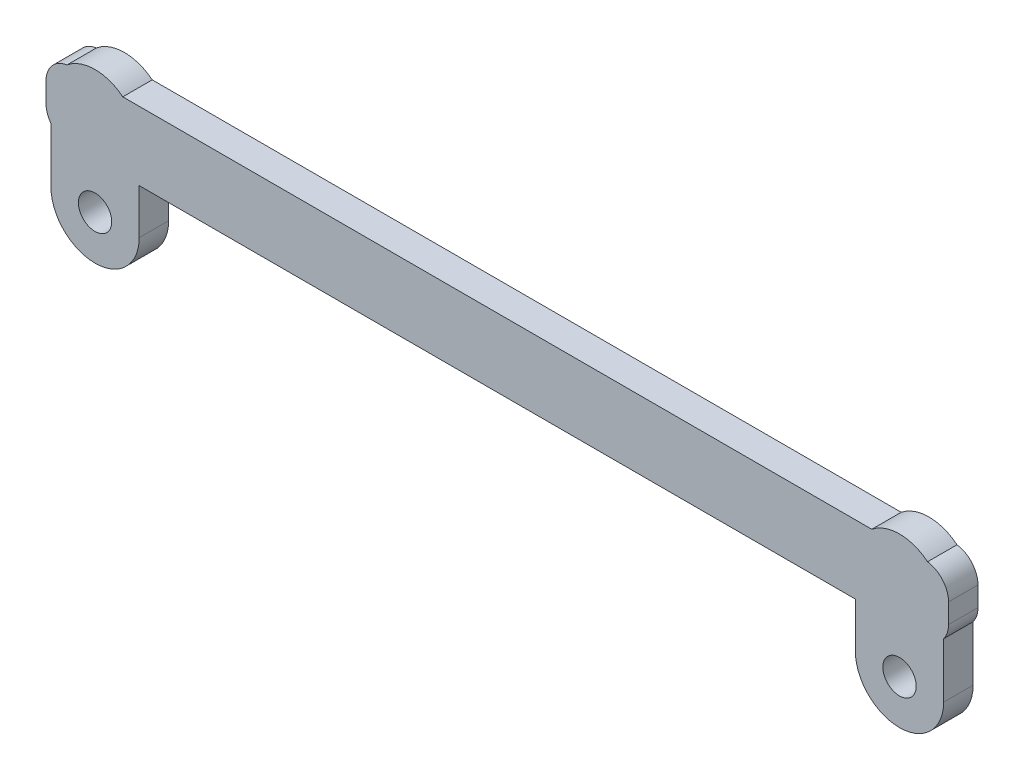
ISO-10303-21;
HEADER;
FILE_DESCRIPTION(('STEP AP214'),'2;1');
FILE_NAME('part.step','',(''),(''),'','','');
FILE_SCHEMA(('AUTOMOTIVE_DESIGN { 1 0 10303 214 1 1 1 1 }'));
ENDSEC;
DATA;
#1=APPLICATION_CONTEXT('core data for automotive mechanical design processes');
#2=APPLICATION_PROTOCOL_DEFINITION('international standard','automotive_design',2000,#1);
#3=PRODUCT_CONTEXT('',#1,'mechanical');
#4=PRODUCT('Part','Part','',(#3));
#5=PRODUCT_RELATED_PRODUCT_CATEGORY('part','',(#4));
#6=PRODUCT_DEFINITION_FORMATION('','',#4);
#7=PRODUCT_DEFINITION_CONTEXT('part definition',#1,'design');
#8=PRODUCT_DEFINITION('design','',#6,#7);
#9=PRODUCT_DEFINITION_SHAPE('','',#8);
#10=(LENGTH_UNIT() NAMED_UNIT(*) SI_UNIT(.MILLI.,.METRE.));
#11=(NAMED_UNIT(*) PLANE_ANGLE_UNIT() SI_UNIT($,.RADIAN.));
#12=(NAMED_UNIT(*) SI_UNIT($,.STERADIAN.) SOLID_ANGLE_UNIT());
#13=UNCERTAINTY_MEASURE_WITH_UNIT(LENGTH_MEASURE(1.E-05),#10,'distance_accuracy_value','');
#14=(GEOMETRIC_REPRESENTATION_CONTEXT(3) GLOBAL_UNCERTAINTY_ASSIGNED_CONTEXT((#13)) GLOBAL_UNIT_ASSIGNED_CONTEXT((#10,
#11,#12)) REPRESENTATION_CONTEXT('',''));
#15=CARTESIAN_POINT('',(0.,0.,0.));
#16=DIRECTION('',(0.,0.,1.));
#17=DIRECTION('',(1.,0.,0.));
#18=AXIS2_PLACEMENT_3D('',#15,#16,#17);
#19=CARTESIAN_POINT('',(-43.5,-53.7,3.));
#20=DIRECTION('',(0.,1.,0.));
#21=DIRECTION('',(0.,0.,1.));
#22=AXIS2_PLACEMENT_3D('',#19,#20,#21);
#23=PLANE('',#22);
#24=DIRECTION('',(0.,0.,-1.));
#25=VECTOR('',#24,1.);
#26=CARTESIAN_POINT('',(36.5,-53.7,3.));
#27=LINE('',#26,#25);
#28=CARTESIAN_POINT('',(36.5,-53.7,3.));
#29=VERTEX_POINT('',#28);
#30=CARTESIAN_POINT('',(36.5,-53.7,0.));
#31=VERTEX_POINT('',#30);
#32=EDGE_CURVE('E65',#29,#31,#27,.T.);
#33=ORIENTED_EDGE('',*,*,#32,.F.);
#34=DIRECTION('',(1.,0.,0.));
#35=VECTOR('',#34,1.);
#36=CARTESIAN_POINT('',(-43.5,-53.7,3.));
#37=LINE('',#36,#35);
#38=CARTESIAN_POINT('',(-36.5,-53.7,3.));
#39=VERTEX_POINT('',#38);
#40=EDGE_CURVE('E238',#39,#29,#37,.T.);
#41=ORIENTED_EDGE('',*,*,#40,.F.);
#42=DIRECTION('',(0.,0.,1.));
#43=VECTOR('',#42,1.);
#44=CARTESIAN_POINT('',(-36.5,-53.7,3.));
#45=LINE('',#44,#43);
#46=CARTESIAN_POINT('',(-36.5,-53.7,0.));
#47=VERTEX_POINT('',#46);
#48=EDGE_CURVE('E11',#47,#39,#45,.T.);
#49=ORIENTED_EDGE('',*,*,#48,.F.);
#50=DIRECTION('',(1.,0.,0.));
#51=VECTOR('',#50,1.);
#52=CARTESIAN_POINT('',(-43.5,-53.7,0.));
#53=LINE('',#52,#51);
#54=EDGE_CURVE('E253',#47,#31,#53,.T.);
#55=ORIENTED_EDGE('',*,*,#54,.T.);
#56=EDGE_LOOP('',(#33,#41,#49,#55));
#57=FACE_BOUND('',#56,.T.);
#58=ADVANCED_FACE('F39',(#57),#23,.F.);
#59=CARTESIAN_POINT('',(43.5,-46.7,3.));
#60=DIRECTION('',(0.,-1.,0.));
#61=DIRECTION('',(0.,0.,-1.));
#62=AXIS2_PLACEMENT_3D('',#59,#60,#61);
#63=PLANE('',#62);
#64=DIRECTION('',(0.,0.,-1.));
#65=VECTOR('',#64,1.);
#66=CARTESIAN_POINT('',(38.1715728752538,-46.7,3.));
#67=LINE('',#66,#65);
#68=CARTESIAN_POINT('',(38.1715728752538,-46.7,0.));
#69=VERTEX_POINT('',#68);
#70=CARTESIAN_POINT('',(38.1715728752538,-46.7,3.));
#71=VERTEX_POINT('',#70);
#72=EDGE_CURVE('E190',#69,#71,#67,.F.);
#73=ORIENTED_EDGE('',*,*,#72,.F.);
#74=DIRECTION('',(-1.,0.,0.));
#75=VECTOR('',#74,1.);
#76=CARTESIAN_POINT('',(43.5,-46.7,0.));
#77=LINE('',#76,#75);
#78=CARTESIAN_POINT('',(-38.1715728752538,-46.7,0.));
#79=VERTEX_POINT('',#78);
#80=EDGE_CURVE('E263',#69,#79,#77,.T.);
#81=ORIENTED_EDGE('',*,*,#80,.T.);
#82=DIRECTION('',(0.,0.,-1.));
#83=VECTOR('',#82,1.);
#84=CARTESIAN_POINT('',(-38.1715728752538,-46.7,3.));
#85=LINE('',#84,#83);
#86=CARTESIAN_POINT('',(-38.1715728752538,-46.7,3.));
#87=VERTEX_POINT('',#86);
#88=EDGE_CURVE('E233',#87,#79,#85,.T.);
#89=ORIENTED_EDGE('',*,*,#88,.F.);
#90=DIRECTION('',(-1.,0.,0.));
#91=VECTOR('',#90,1.);
#92=CARTESIAN_POINT('',(43.5,-46.7,3.));
#93=LINE('',#92,#91);
#94=EDGE_CURVE('E250',#71,#87,#93,.T.);
#95=ORIENTED_EDGE('',*,*,#94,.F.);
#96=EDGE_LOOP('',(#73,#81,#89,#95));
#97=FACE_BOUND('',#96,.T.);
#98=ADVANCED_FACE('F337',(#97),#63,.F.);
#99=CARTESIAN_POINT('',(43.5,-51.2,3.));
#100=DIRECTION('',(0.,0.,-1.));
#101=DIRECTION('',(-1.,0.,0.));
#102=AXIS2_PLACEMENT_3D('',#99,#100,#101);
#103=CYLINDRICAL_SURFACE('',#102,2.50000000000001);
#104=DIRECTION('',(0.,0.,-1.));
#105=VECTOR('',#104,1.);
#106=CARTESIAN_POINT('',(45.5,-52.7,3.));
#107=LINE('',#106,#105);
#108=CARTESIAN_POINT('',(45.5,-52.7,0.));
#109=VERTEX_POINT('',#108);
#110=CARTESIAN_POINT('',(45.5,-52.7,3.));
#111=VERTEX_POINT('',#110);
#112=EDGE_CURVE('E163',#109,#111,#107,.F.);
#113=ORIENTED_EDGE('',*,*,#112,.F.);
#114=CARTESIAN_POINT('',(43.5,-51.2,0.));
#115=DIRECTION('',(0.,0.,1.));
#116=DIRECTION('',(1.,0.,0.));
#117=AXIS2_PLACEMENT_3D('',#114,#115,#116);
#118=CIRCLE('',#117,2.50000000000001);
#119=CARTESIAN_POINT('',(46.,-51.2,0.));
#120=VERTEX_POINT('',#119);
#121=EDGE_CURVE('E260',#109,#120,#118,.T.);
#122=ORIENTED_EDGE('',*,*,#121,.T.);
#123=DIRECTION('',(0.,0.,-1.));
#124=VECTOR('',#123,1.);
#125=CARTESIAN_POINT('',(46.,-51.2,3.));
#126=LINE('',#125,#124);
#127=CARTESIAN_POINT('',(46.,-51.2,3.));
#128=VERTEX_POINT('',#127);
#129=EDGE_CURVE('E50',#128,#120,#126,.T.);
#130=ORIENTED_EDGE('',*,*,#129,.F.);
#131=CARTESIAN_POINT('',(43.5,-51.2,3.));
#132=DIRECTION('',(0.,0.,1.));
#133=DIRECTION('',(1.,0.,0.));
#134=AXIS2_PLACEMENT_3D('',#131,#132,#133);
#135=CIRCLE('',#134,2.50000000000001);
#136=EDGE_CURVE('E241',#111,#128,#135,.T.);
#137=ORIENTED_EDGE('',*,*,#136,.F.);
#138=EDGE_LOOP('',(#113,#122,#130,#137));
#139=FACE_BOUND('',#138,.T.);
#140=ADVANCED_FACE('F336',(#139),#103,.T.);
#141=CARTESIAN_POINT('',(43.5,-49.2,3.));
#142=DIRECTION('',(0.,0.,-1.));
#143=DIRECTION('',(-1.,0.,0.));
#144=AXIS2_PLACEMENT_3D('',#141,#142,#143);
#145=CYLINDRICAL_SURFACE('',#144,2.5);
#146=DIRECTION('',(0.,0.,-1.));
#147=VECTOR('',#146,1.);
#148=CARTESIAN_POINT('',(43.8604484305364,-46.7261210763411,1.5));
#149=LINE('',#148,#147);
#150=CARTESIAN_POINT('',(43.8604484305364,-46.7261210763411,3.));
#151=VERTEX_POINT('',#150);
#152=CARTESIAN_POINT('',(43.8604484305364,-46.7261210763411,0.));
#153=VERTEX_POINT('',#152);
#154=EDGE_CURVE('E53',#151,#153,#149,.T.);
#155=ORIENTED_EDGE('',*,*,#154,.F.);
#156=CARTESIAN_POINT('',(43.5,-49.2,3.));
#157=DIRECTION('',(0.,0.,1.));
#158=DIRECTION('',(1.,0.,0.));
#159=AXIS2_PLACEMENT_3D('',#156,#157,#158);
#160=CIRCLE('',#159,2.5);
#161=CARTESIAN_POINT('',(46.,-49.2,3.));
#162=VERTEX_POINT('',#161);
#163=EDGE_CURVE('E244',#162,#151,#160,.T.);
#164=ORIENTED_EDGE('',*,*,#163,.F.);
#165=DIRECTION('',(0.,0.,-1.));
#166=VECTOR('',#165,1.);
#167=CARTESIAN_POINT('',(46.,-49.2,3.));
#168=LINE('',#167,#166);
#169=CARTESIAN_POINT('',(46.,-49.2,0.));
#170=VERTEX_POINT('',#169);
#171=EDGE_CURVE('E271',#162,#170,#168,.T.);
#172=ORIENTED_EDGE('',*,*,#171,.T.);
#173=CARTESIAN_POINT('',(43.5,-49.2,0.));
#174=DIRECTION('',(0.,0.,1.));
#175=DIRECTION('',(1.,0.,0.));
#176=AXIS2_PLACEMENT_3D('',#173,#174,#175);
#177=CIRCLE('',#176,2.5);
#178=EDGE_CURVE('E261',#170,#153,#177,.T.);
#179=ORIENTED_EDGE('',*,*,#178,.T.);
#180=EDGE_LOOP('',(#155,#164,#172,#179));
#181=FACE_BOUND('',#180,.T.);
#182=ADVANCED_FACE('F292',(#181),#145,.T.);
#183=CARTESIAN_POINT('',(-43.5,-51.2,3.));
#184=DIRECTION('',(0.,0.,-1.));
#185=DIRECTION('',(-1.,0.,0.));
#186=AXIS2_PLACEMENT_3D('',#183,#184,#185);
#187=CYLINDRICAL_SURFACE('',#186,2.50000000000001);
#188=DIRECTION('',(0.,0.,-1.));
#189=VECTOR('',#188,1.);
#190=CARTESIAN_POINT('',(-45.5,-52.7,3.));
#191=LINE('',#190,#189);
#192=CARTESIAN_POINT('',(-45.5,-52.7,3.));
#193=VERTEX_POINT('',#192);
#194=CARTESIAN_POINT('',(-45.5,-52.7,0.));
#195=VERTEX_POINT('',#194);
#196=EDGE_CURVE('E223',#193,#195,#191,.T.);
#197=ORIENTED_EDGE('',*,*,#196,.F.);
#198=CARTESIAN_POINT('',(-43.5,-51.2,3.));
#199=DIRECTION('',(0.,0.,1.));
#200=DIRECTION('',(1.,0.,0.));
#201=AXIS2_PLACEMENT_3D('',#198,#199,#200);
#202=CIRCLE('',#201,2.50000000000001);
#203=CARTESIAN_POINT('',(-46.,-51.2,3.));
#204=VERTEX_POINT('',#203);
#205=EDGE_CURVE('E232',#204,#193,#202,.T.);
#206=ORIENTED_EDGE('',*,*,#205,.F.);
#207=DIRECTION('',(0.,0.,-1.));
#208=VECTOR('',#207,1.);
#209=CARTESIAN_POINT('',(-46.,-51.2,3.));
#210=LINE('',#209,#208);
#211=CARTESIAN_POINT('',(-46.,-51.2,0.));
#212=VERTEX_POINT('',#211);
#213=EDGE_CURVE('E254',#204,#212,#210,.T.);
#214=ORIENTED_EDGE('',*,*,#213,.T.);
#215=CARTESIAN_POINT('',(-43.5,-51.2,0.));
#216=DIRECTION('',(0.,0.,1.));
#217=DIRECTION('',(1.,0.,0.));
#218=AXIS2_PLACEMENT_3D('',#215,#216,#217);
#219=CIRCLE('',#218,2.50000000000001);
#220=EDGE_CURVE('E234',#212,#195,#219,.T.);
#221=ORIENTED_EDGE('',*,*,#220,.T.);
#222=EDGE_LOOP('',(#197,#206,#214,#221));
#223=FACE_BOUND('',#222,.T.);
#224=ADVANCED_FACE('F41',(#223),#187,.T.);
#225=CARTESIAN_POINT('',(-43.5,-49.2,3.));
#226=DIRECTION('',(0.,0.,-1.));
#227=DIRECTION('',(-1.,0.,0.));
#228=AXIS2_PLACEMENT_3D('',#225,#226,#227);
#229=CYLINDRICAL_SURFACE('',#228,2.5);
#230=DIRECTION('',(0.,0.,-1.));
#231=VECTOR('',#230,1.);
#232=CARTESIAN_POINT('',(-43.8604484305364,-46.7261210763411,1.5));
#233=LINE('',#232,#231);
#234=CARTESIAN_POINT('',(-43.8604484305364,-46.7261210763411,0.));
#235=VERTEX_POINT('',#234);
#236=CARTESIAN_POINT('',(-43.8604484305364,-46.7261210763411,3.));
#237=VERTEX_POINT('',#236);
#238=EDGE_CURVE('E226',#235,#237,#233,.F.);
#239=ORIENTED_EDGE('',*,*,#238,.F.);
#240=CARTESIAN_POINT('',(-43.5,-49.2,0.));
#241=DIRECTION('',(0.,0.,1.));
#242=DIRECTION('',(1.,0.,0.));
#243=AXIS2_PLACEMENT_3D('',#240,#241,#242);
#244=CIRCLE('',#243,2.5);
#245=CARTESIAN_POINT('',(-46.,-49.2,0.));
#246=VERTEX_POINT('',#245);
#247=EDGE_CURVE('E264',#235,#246,#244,.T.);
#248=ORIENTED_EDGE('',*,*,#247,.T.);
#249=DIRECTION('',(0.,0.,-1.));
#250=VECTOR('',#249,1.);
#251=CARTESIAN_POINT('',(-46.,-49.2,3.));
#252=LINE('',#251,#250);
#253=CARTESIAN_POINT('',(-46.,-49.2,3.));
#254=VERTEX_POINT('',#253);
#255=EDGE_CURVE('E268',#254,#246,#252,.T.);
#256=ORIENTED_EDGE('',*,*,#255,.F.);
#257=CARTESIAN_POINT('',(-43.5,-49.2,3.));
#258=DIRECTION('',(0.,0.,1.));
#259=DIRECTION('',(1.,0.,0.));
#260=AXIS2_PLACEMENT_3D('',#257,#258,#259);
#261=CIRCLE('',#260,2.5);
#262=EDGE_CURVE('E248',#237,#254,#261,.T.);
#263=ORIENTED_EDGE('',*,*,#262,.F.);
#264=EDGE_LOOP('',(#239,#248,#256,#263));
#265=FACE_BOUND('',#264,.T.);
#266=ADVANCED_FACE('F350',(#265),#229,.T.);
#267=CARTESIAN_POINT('',(46.,-51.2,3.));
#268=DIRECTION('',(-1.,0.,0.));
#269=DIRECTION('',(0.,0.,1.));
#270=AXIS2_PLACEMENT_3D('',#267,#268,#269);
#271=PLANE('',#270);
#272=DIRECTION('',(0.,1.,0.));
#273=VECTOR('',#272,1.);
#274=CARTESIAN_POINT('',(46.,-51.2,0.));
#275=LINE('',#274,#273);
#276=EDGE_CURVE('E256',#120,#170,#275,.T.);
#277=ORIENTED_EDGE('',*,*,#276,.T.);
#278=ORIENTED_EDGE('',*,*,#171,.F.);
#279=DIRECTION('',(0.,1.,0.));
#280=VECTOR('',#279,1.);
#281=CARTESIAN_POINT('',(46.,-51.2,3.));
#282=LINE('',#281,#280);
#283=EDGE_CURVE('E243',#128,#162,#282,.T.);
#284=ORIENTED_EDGE('',*,*,#283,.F.);
#285=ORIENTED_EDGE('',*,*,#129,.T.);
#286=EDGE_LOOP('',(#277,#278,#284,#285));
#287=FACE_BOUND('',#286,.T.);
#288=ADVANCED_FACE('F278',(#287),#271,.F.);
#289=CARTESIAN_POINT('',(-46.,-49.2,3.));
#290=DIRECTION('',(1.,0.,0.));
#291=DIRECTION('',(0.,0.,-1.));
#292=AXIS2_PLACEMENT_3D('',#289,#290,#291);
#293=PLANE('',#292);
#294=DIRECTION('',(0.,-1.,0.));
#295=VECTOR('',#294,1.);
#296=CARTESIAN_POINT('',(-46.,-49.2,0.));
#297=LINE('',#296,#295);
#298=EDGE_CURVE('E237',#246,#212,#297,.T.);
#299=ORIENTED_EDGE('',*,*,#298,.T.);
#300=ORIENTED_EDGE('',*,*,#213,.F.);
#301=DIRECTION('',(0.,-1.,0.));
#302=VECTOR('',#301,1.);
#303=CARTESIAN_POINT('',(-46.,-49.2,3.));
#304=LINE('',#303,#302);
#305=EDGE_CURVE('E252',#254,#204,#304,.T.);
#306=ORIENTED_EDGE('',*,*,#305,.F.);
#307=ORIENTED_EDGE('',*,*,#255,.T.);
#308=EDGE_LOOP('',(#299,#300,#306,#307));
#309=FACE_BOUND('',#308,.T.);
#310=ADVANCED_FACE('F330',(#309),#293,.F.);
#311=CARTESIAN_POINT('',(-43.5,-51.2,3.));
#312=DIRECTION('',(0.,0.,1.));
#313=DIRECTION('',(1.,0.,0.));
#314=AXIS2_PLACEMENT_3D('',#311,#312,#313);
#315=PLANE('',#314);
#316=CARTESIAN_POINT('',(41.,-50.2,3.));
#317=DIRECTION('',(0.,0.,1.));
#318=DIRECTION('',(-1.,0.,0.));
#319=AXIS2_PLACEMENT_3D('',#316,#317,#318);
#320=CIRCLE('',#319,4.5);
#321=EDGE_CURVE('E161',#151,#71,#320,.T.);
#322=ORIENTED_EDGE('',*,*,#321,.T.);
#323=ORIENTED_EDGE('',*,*,#94,.T.);
#324=CARTESIAN_POINT('',(-41.,-50.2,3.));
#325=DIRECTION('',(0.,0.,1.));
#326=DIRECTION('',(-1.,0.,0.));
#327=AXIS2_PLACEMENT_3D('',#324,#325,#326);
#328=CIRCLE('',#327,4.5);
#329=EDGE_CURVE('E203',#87,#237,#328,.T.);
#330=ORIENTED_EDGE('',*,*,#329,.T.);
#331=ORIENTED_EDGE('',*,*,#262,.T.);
#332=ORIENTED_EDGE('',*,*,#305,.T.);
#333=ORIENTED_EDGE('',*,*,#205,.T.);
#334=DIRECTION('',(0.,-1.,0.));
#335=VECTOR('',#334,1.);
#336=CARTESIAN_POINT('',(-45.5,-58.3,3.));
#337=LINE('',#336,#335);
#338=CARTESIAN_POINT('',(-45.5,-58.3,3.));
#339=VERTEX_POINT('',#338);
#340=EDGE_CURVE('E206',#193,#339,#337,.T.);
#341=ORIENTED_EDGE('',*,*,#340,.T.);
#342=CARTESIAN_POINT('',(-41.,-58.3,3.));
#343=DIRECTION('',(0.,0.,1.));
#344=DIRECTION('',(-1.,0.,0.));
#345=AXIS2_PLACEMENT_3D('',#342,#343,#344);
#346=CIRCLE('',#345,4.5);
#347=CARTESIAN_POINT('',(-36.5,-58.3,3.));
#348=VERTEX_POINT('',#347);
#349=EDGE_CURVE('E198',#339,#348,#346,.T.);
#350=ORIENTED_EDGE('',*,*,#349,.T.);
#351=DIRECTION('',(0.,1.,0.));
#352=VECTOR('',#351,1.);
#353=CARTESIAN_POINT('',(-36.5,-50.2,3.));
#354=LINE('',#353,#352);
#355=EDGE_CURVE('E202',#348,#39,#354,.T.);
#356=ORIENTED_EDGE('',*,*,#355,.T.);
#357=ORIENTED_EDGE('',*,*,#40,.T.);
#358=DIRECTION('',(0.,-1.,0.));
#359=VECTOR('',#358,1.);
#360=CARTESIAN_POINT('',(36.5,-58.3,3.));
#361=LINE('',#360,#359);
#362=CARTESIAN_POINT('',(36.5,-58.3,3.));
#363=VERTEX_POINT('',#362);
#364=EDGE_CURVE('E171',#29,#363,#361,.T.);
#365=ORIENTED_EDGE('',*,*,#364,.T.);
#366=CARTESIAN_POINT('',(41.,-58.3,3.));
#367=DIRECTION('',(0.,0.,1.));
#368=DIRECTION('',(-1.,0.,0.));
#369=AXIS2_PLACEMENT_3D('',#366,#367,#368);
#370=CIRCLE('',#369,4.5);
#371=CARTESIAN_POINT('',(45.5,-58.3,3.));
#372=VERTEX_POINT('',#371);
#373=EDGE_CURVE('E165',#363,#372,#370,.T.);
#374=ORIENTED_EDGE('',*,*,#373,.T.);
#375=DIRECTION('',(0.,1.,0.));
#376=VECTOR('',#375,1.);
#377=CARTESIAN_POINT('',(45.5,-50.2,3.));
#378=LINE('',#377,#376);
#379=EDGE_CURVE('E152',#372,#111,#378,.T.);
#380=ORIENTED_EDGE('',*,*,#379,.T.);
#381=ORIENTED_EDGE('',*,*,#136,.T.);
#382=ORIENTED_EDGE('',*,*,#283,.T.);
#383=ORIENTED_EDGE('',*,*,#163,.T.);
#384=EDGE_LOOP('',(#322,#323,#330,#331,#332,#333,#341,#350,#356,#357,#365,#374,#380,#381,#382,#383));
#385=FACE_BOUND('',#384,.T.);
#386=CARTESIAN_POINT('',(-41.,-58.3,3.));
#387=DIRECTION('',(0.,0.,1.));
#388=DIRECTION('',(1.,0.,0.));
#389=AXIS2_PLACEMENT_3D('',#386,#387,#388);
#390=CIRCLE('',#389,1.69999999999999);
#391=CARTESIAN_POINT('',(-39.3,-58.3,3.));
#392=VERTEX_POINT('',#391);
#393=EDGE_CURVE('E195',#392,#392,#390,.T.);
#394=ORIENTED_EDGE('',*,*,#393,.F.);
#395=EDGE_LOOP('',(#394));
#396=FACE_BOUND('',#395,.T.);
#397=CARTESIAN_POINT('',(41.,-58.3,3.));
#398=DIRECTION('',(0.,0.,1.));
#399=DIRECTION('',(1.,0.,0.));
#400=AXIS2_PLACEMENT_3D('',#397,#398,#399);
#401=CIRCLE('',#400,1.70000000000001);
#402=CARTESIAN_POINT('',(42.7,-58.3,3.));
#403=VERTEX_POINT('',#402);
#404=EDGE_CURVE('E301',#403,#403,#401,.T.);
#405=ORIENTED_EDGE('',*,*,#404,.F.);
#406=EDGE_LOOP('',(#405));
#407=FACE_BOUND('',#406,.T.);
#408=ADVANCED_FACE('F166',(#385,#396,#407),#315,.T.);
#409=CARTESIAN_POINT('',(-43.5,-51.2,0.));
#410=DIRECTION('',(0.,0.,1.));
#411=DIRECTION('',(1.,0.,0.));
#412=AXIS2_PLACEMENT_3D('',#409,#410,#411);
#413=PLANE('',#412);
#414=ORIENTED_EDGE('',*,*,#80,.F.);
#415=CARTESIAN_POINT('',(41.,-50.2,0.));
#416=DIRECTION('',(0.,0.,1.));
#417=DIRECTION('',(-1.,0.,0.));
#418=AXIS2_PLACEMENT_3D('',#415,#416,#417);
#419=CIRCLE('',#418,4.5);
#420=EDGE_CURVE('E293',#153,#69,#419,.T.);
#421=ORIENTED_EDGE('',*,*,#420,.F.);
#422=ORIENTED_EDGE('',*,*,#178,.F.);
#423=ORIENTED_EDGE('',*,*,#276,.F.);
#424=ORIENTED_EDGE('',*,*,#121,.F.);
#425=DIRECTION('',(0.,1.,0.));
#426=VECTOR('',#425,1.);
#427=CARTESIAN_POINT('',(45.5,-50.2,0.));
#428=LINE('',#427,#426);
#429=CARTESIAN_POINT('',(45.5,-58.3,0.));
#430=VERTEX_POINT('',#429);
#431=EDGE_CURVE('E297',#430,#109,#428,.T.);
#432=ORIENTED_EDGE('',*,*,#431,.F.);
#433=CARTESIAN_POINT('',(41.,-58.3,0.));
#434=DIRECTION('',(0.,0.,1.));
#435=DIRECTION('',(-1.,0.,0.));
#436=AXIS2_PLACEMENT_3D('',#433,#434,#435);
#437=CIRCLE('',#436,4.5);
#438=CARTESIAN_POINT('',(36.5,-58.3,0.));
#439=VERTEX_POINT('',#438);
#440=EDGE_CURVE('E177',#439,#430,#437,.T.);
#441=ORIENTED_EDGE('',*,*,#440,.F.);
#442=DIRECTION('',(0.,-1.,0.));
#443=VECTOR('',#442,1.);
#444=CARTESIAN_POINT('',(36.5,-58.3,0.));
#445=LINE('',#444,#443);
#446=EDGE_CURVE('E174',#31,#439,#445,.T.);
#447=ORIENTED_EDGE('',*,*,#446,.F.);
#448=ORIENTED_EDGE('',*,*,#54,.F.);
#449=DIRECTION('',(0.,1.,0.));
#450=VECTOR('',#449,1.);
#451=CARTESIAN_POINT('',(-36.5,-50.2,0.));
#452=LINE('',#451,#450);
#453=CARTESIAN_POINT('',(-36.5,-58.3,0.));
#454=VERTEX_POINT('',#453);
#455=EDGE_CURVE('E214',#454,#47,#452,.T.);
#456=ORIENTED_EDGE('',*,*,#455,.F.);
#457=CARTESIAN_POINT('',(-41.,-58.3,0.));
#458=DIRECTION('',(0.,0.,1.));
#459=DIRECTION('',(-1.,0.,0.));
#460=AXIS2_PLACEMENT_3D('',#457,#458,#459);
#461=CIRCLE('',#460,4.5);
#462=CARTESIAN_POINT('',(-45.5,-58.3,0.));
#463=VERTEX_POINT('',#462);
#464=EDGE_CURVE('E193',#463,#454,#461,.T.);
#465=ORIENTED_EDGE('',*,*,#464,.F.);
#466=DIRECTION('',(0.,-1.,0.));
#467=VECTOR('',#466,1.);
#468=CARTESIAN_POINT('',(-45.5,-58.3,0.));
#469=LINE('',#468,#467);
#470=EDGE_CURVE('E204',#195,#463,#469,.T.);
#471=ORIENTED_EDGE('',*,*,#470,.F.);
#472=ORIENTED_EDGE('',*,*,#220,.F.);
#473=ORIENTED_EDGE('',*,*,#298,.F.);
#474=ORIENTED_EDGE('',*,*,#247,.F.);
#475=CARTESIAN_POINT('',(-41.,-50.2,0.));
#476=DIRECTION('',(0.,0.,1.));
#477=DIRECTION('',(-1.,0.,0.));
#478=AXIS2_PLACEMENT_3D('',#475,#476,#477);
#479=CIRCLE('',#478,4.5);
#480=EDGE_CURVE('E216',#79,#235,#479,.T.);
#481=ORIENTED_EDGE('',*,*,#480,.F.);
#482=EDGE_LOOP('',(#414,#421,#422,#423,#424,#432,#441,#447,#448,#456,#465,#471,#472,#473,#474,#481));
#483=FACE_BOUND('',#482,.T.);
#484=CARTESIAN_POINT('',(-41.,-58.3,0.));
#485=DIRECTION('',(0.,0.,1.));
#486=DIRECTION('',(1.,0.,0.));
#487=AXIS2_PLACEMENT_3D('',#484,#485,#486);
#488=CIRCLE('',#487,1.69999999999999);
#489=CARTESIAN_POINT('',(-39.3,-58.3,0.));
#490=VERTEX_POINT('',#489);
#491=EDGE_CURVE('E192',#490,#490,#488,.T.);
#492=ORIENTED_EDGE('',*,*,#491,.T.);
#493=EDGE_LOOP('',(#492));
#494=FACE_BOUND('',#493,.T.);
#495=CARTESIAN_POINT('',(41.,-58.3,0.));
#496=DIRECTION('',(0.,0.,1.));
#497=DIRECTION('',(1.,0.,0.));
#498=AXIS2_PLACEMENT_3D('',#495,#496,#497);
#499=CIRCLE('',#498,1.70000000000001);
#500=CARTESIAN_POINT('',(42.7,-58.3,0.));
#501=VERTEX_POINT('',#500);
#502=EDGE_CURVE('E517',#501,#501,#499,.T.);
#503=ORIENTED_EDGE('',*,*,#502,.T.);
#504=EDGE_LOOP('',(#503));
#505=FACE_BOUND('',#504,.T.);
#506=ADVANCED_FACE('F289',(#483,#494,#505),#413,.F.);
#507=CARTESIAN_POINT('',(-41.,-50.2,3.));
#508=DIRECTION('',(0.,0.,-1.));
#509=DIRECTION('',(-1.,0.,0.));
#510=AXIS2_PLACEMENT_3D('',#507,#508,#509);
#511=CYLINDRICAL_SURFACE('',#510,4.5);
#512=ORIENTED_EDGE('',*,*,#329,.F.);
#513=ORIENTED_EDGE('',*,*,#88,.T.);
#514=ORIENTED_EDGE('',*,*,#480,.T.);
#515=ORIENTED_EDGE('',*,*,#238,.T.);
#516=EDGE_LOOP('',(#512,#513,#514,#515));
#517=FACE_BOUND('',#516,.T.);
#518=ADVANCED_FACE('F335',(#517),#511,.T.);
#519=CARTESIAN_POINT('',(-36.5,-50.2,3.));
#520=DIRECTION('',(-1.,0.,0.));
#521=DIRECTION('',(0.,0.,1.));
#522=AXIS2_PLACEMENT_3D('',#519,#520,#521);
#523=PLANE('',#522);
#524=ORIENTED_EDGE('',*,*,#455,.T.);
#525=ORIENTED_EDGE('',*,*,#48,.T.);
#526=ORIENTED_EDGE('',*,*,#355,.F.);
#527=DIRECTION('',(0.,0.,-1.));
#528=VECTOR('',#527,1.);
#529=CARTESIAN_POINT('',(-36.5,-58.3,3.));
#530=LINE('',#529,#528);
#531=EDGE_CURVE('E224',#348,#454,#530,.T.);
#532=ORIENTED_EDGE('',*,*,#531,.T.);
#533=EDGE_LOOP('',(#524,#525,#526,#532));
#534=FACE_BOUND('',#533,.T.);
#535=ADVANCED_FACE('F307',(#534),#523,.F.);
#536=CARTESIAN_POINT('',(-45.5,-58.3,3.));
#537=DIRECTION('',(1.,0.,0.));
#538=DIRECTION('',(0.,0.,-1.));
#539=AXIS2_PLACEMENT_3D('',#536,#537,#538);
#540=PLANE('',#539);
#541=ORIENTED_EDGE('',*,*,#340,.F.);
#542=ORIENTED_EDGE('',*,*,#196,.T.);
#543=ORIENTED_EDGE('',*,*,#470,.T.);
#544=DIRECTION('',(0.,0.,-1.));
#545=VECTOR('',#544,1.);
#546=CARTESIAN_POINT('',(-45.5,-58.3,3.));
#547=LINE('',#546,#545);
#548=EDGE_CURVE('E208',#339,#463,#547,.T.);
#549=ORIENTED_EDGE('',*,*,#548,.F.);
#550=EDGE_LOOP('',(#541,#542,#543,#549));
#551=FACE_BOUND('',#550,.T.);
#552=ADVANCED_FACE('F318',(#551),#540,.F.);
#553=CARTESIAN_POINT('',(-41.,-58.3,3.));
#554=DIRECTION('',(0.,0.,-1.));
#555=DIRECTION('',(-1.,0.,0.));
#556=AXIS2_PLACEMENT_3D('',#553,#554,#555);
#557=CYLINDRICAL_SURFACE('',#556,4.5);
#558=ORIENTED_EDGE('',*,*,#464,.T.);
#559=ORIENTED_EDGE('',*,*,#531,.F.);
#560=ORIENTED_EDGE('',*,*,#349,.F.);
#561=ORIENTED_EDGE('',*,*,#548,.T.);
#562=EDGE_LOOP('',(#558,#559,#560,#561));
#563=FACE_BOUND('',#562,.T.);
#564=ADVANCED_FACE('F312',(#563),#557,.T.);
#565=CARTESIAN_POINT('',(-41.,-58.3,3.));
#566=DIRECTION('',(0.,0.,-1.));
#567=DIRECTION('',(-1.,0.,0.));
#568=AXIS2_PLACEMENT_3D('',#565,#566,#567);
#569=CYLINDRICAL_SURFACE('',#568,1.69999999999999);
#570=ORIENTED_EDGE('',*,*,#393,.T.);
#571=EDGE_LOOP('',(#570));
#572=FACE_BOUND('',#571,.T.);
#573=ORIENTED_EDGE('',*,*,#491,.F.);
#574=EDGE_LOOP('',(#573));
#575=FACE_BOUND('',#574,.T.);
#576=ADVANCED_FACE('F433',(#572,#575),#569,.F.);
#577=CARTESIAN_POINT('',(41.,-50.2,3.));
#578=DIRECTION('',(0.,0.,-1.));
#579=DIRECTION('',(-1.,0.,0.));
#580=AXIS2_PLACEMENT_3D('',#577,#578,#579);
#581=CYLINDRICAL_SURFACE('',#580,4.5);
#582=ORIENTED_EDGE('',*,*,#420,.T.);
#583=ORIENTED_EDGE('',*,*,#72,.T.);
#584=ORIENTED_EDGE('',*,*,#321,.F.);
#585=ORIENTED_EDGE('',*,*,#154,.T.);
#586=EDGE_LOOP('',(#582,#583,#584,#585));
#587=FACE_BOUND('',#586,.T.);
#588=ADVANCED_FACE('F294',(#587),#581,.T.);
#589=CARTESIAN_POINT('',(45.5,-50.2,3.));
#590=DIRECTION('',(-1.,0.,0.));
#591=DIRECTION('',(0.,0.,1.));
#592=AXIS2_PLACEMENT_3D('',#589,#590,#591);
#593=PLANE('',#592);
#594=ORIENTED_EDGE('',*,*,#431,.T.);
#595=ORIENTED_EDGE('',*,*,#112,.T.);
#596=ORIENTED_EDGE('',*,*,#379,.F.);
#597=DIRECTION('',(0.,0.,-1.));
#598=VECTOR('',#597,1.);
#599=CARTESIAN_POINT('',(45.5,-58.3,3.));
#600=LINE('',#599,#598);
#601=EDGE_CURVE('E156',#372,#430,#600,.T.);
#602=ORIENTED_EDGE('',*,*,#601,.T.);
#603=EDGE_LOOP('',(#594,#595,#596,#602));
#604=FACE_BOUND('',#603,.T.);
#605=ADVANCED_FACE('F159',(#604),#593,.F.);
#606=CARTESIAN_POINT('',(36.5,-58.3,3.));
#607=DIRECTION('',(1.,0.,0.));
#608=DIRECTION('',(0.,0.,-1.));
#609=AXIS2_PLACEMENT_3D('',#606,#607,#608);
#610=PLANE('',#609);
#611=ORIENTED_EDGE('',*,*,#364,.F.);
#612=ORIENTED_EDGE('',*,*,#32,.T.);
#613=ORIENTED_EDGE('',*,*,#446,.T.);
#614=DIRECTION('',(0.,0.,-1.));
#615=VECTOR('',#614,1.);
#616=CARTESIAN_POINT('',(36.5,-58.3,3.));
#617=LINE('',#616,#615);
#618=EDGE_CURVE('E179',#363,#439,#617,.T.);
#619=ORIENTED_EDGE('',*,*,#618,.F.);
#620=EDGE_LOOP('',(#611,#612,#613,#619));
#621=FACE_BOUND('',#620,.T.);
#622=ADVANCED_FACE('F304',(#621),#610,.F.);
#623=CARTESIAN_POINT('',(41.,-58.3,3.));
#624=DIRECTION('',(0.,0.,-1.));
#625=DIRECTION('',(-1.,0.,0.));
#626=AXIS2_PLACEMENT_3D('',#623,#624,#625);
#627=CYLINDRICAL_SURFACE('',#626,4.5);
#628=ORIENTED_EDGE('',*,*,#440,.T.);
#629=ORIENTED_EDGE('',*,*,#601,.F.);
#630=ORIENTED_EDGE('',*,*,#373,.F.);
#631=ORIENTED_EDGE('',*,*,#618,.T.);
#632=EDGE_LOOP('',(#628,#629,#630,#631));
#633=FACE_BOUND('',#632,.T.);
#634=ADVANCED_FACE('F180',(#633),#627,.T.);
#635=CARTESIAN_POINT('',(41.,-58.3,3.));
#636=DIRECTION('',(0.,0.,-1.));
#637=DIRECTION('',(-1.,0.,0.));
#638=AXIS2_PLACEMENT_3D('',#635,#636,#637);
#639=CYLINDRICAL_SURFACE('',#638,1.70000000000001);
#640=ORIENTED_EDGE('',*,*,#404,.T.);
#641=EDGE_LOOP('',(#640));
#642=FACE_BOUND('',#641,.T.);
#643=ORIENTED_EDGE('',*,*,#502,.F.);
#644=EDGE_LOOP('',(#643));
#645=FACE_BOUND('',#644,.T.);
#646=ADVANCED_FACE('F494',(#642,#645),#639,.F.);
#647=CLOSED_SHELL('',(#58,#98,#140,#182,#224,#266,#288,#310,#408,#506,#518,#535,#552,#564,#576,
#588,#605,#622,#634,#646));
#648=MANIFOLD_SOLID_BREP('B2',#647);
#649=ADVANCED_BREP_SHAPE_REPRESENTATION('',(#18,#648),#14);
#650=SHAPE_DEFINITION_REPRESENTATION(#9,#649);
ENDSEC;
END-ISO-10303-21;
